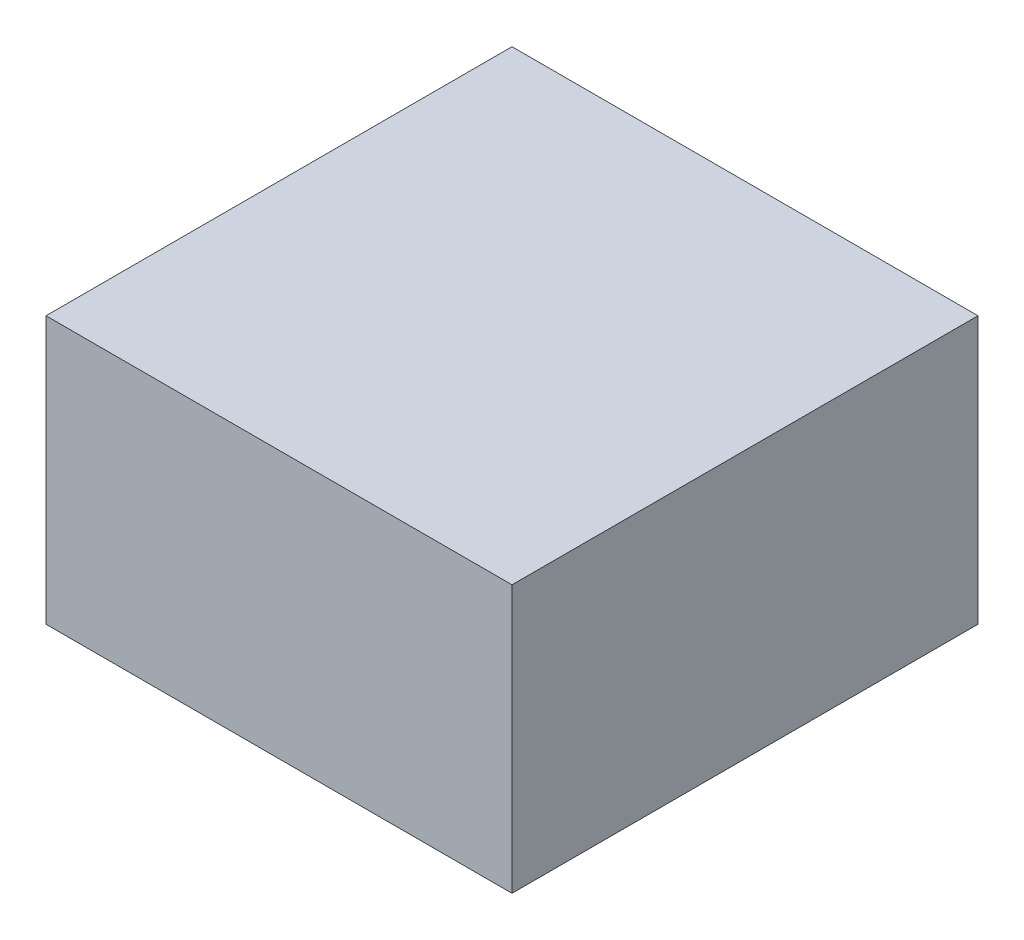
ISO-10303-21;
HEADER;
FILE_DESCRIPTION(('STEP AP214'),'2;1');
FILE_NAME('part.step','',(''),(''),'','','');
FILE_SCHEMA(('AUTOMOTIVE_DESIGN { 1 0 10303 214 1 1 1 1 }'));
ENDSEC;
DATA;
#1=APPLICATION_CONTEXT('core data for automotive mechanical design processes');
#2=APPLICATION_PROTOCOL_DEFINITION('international standard','automotive_design',2000,#1);
#3=PRODUCT_CONTEXT('',#1,'mechanical');
#4=PRODUCT('Part','Part','',(#3));
#5=PRODUCT_RELATED_PRODUCT_CATEGORY('part','',(#4));
#6=PRODUCT_DEFINITION_FORMATION('','',#4);
#7=PRODUCT_DEFINITION_CONTEXT('part definition',#1,'design');
#8=PRODUCT_DEFINITION('design','',#6,#7);
#9=PRODUCT_DEFINITION_SHAPE('','',#8);
#10=(LENGTH_UNIT() NAMED_UNIT(*) SI_UNIT(.MILLI.,.METRE.));
#11=(NAMED_UNIT(*) PLANE_ANGLE_UNIT() SI_UNIT($,.RADIAN.));
#12=(NAMED_UNIT(*) SI_UNIT($,.STERADIAN.) SOLID_ANGLE_UNIT());
#13=UNCERTAINTY_MEASURE_WITH_UNIT(LENGTH_MEASURE(1.E-05),#10,'distance_accuracy_value','');
#14=(GEOMETRIC_REPRESENTATION_CONTEXT(3) GLOBAL_UNCERTAINTY_ASSIGNED_CONTEXT((#13)) GLOBAL_UNIT_ASSIGNED_CONTEXT((#10,
#11,#12)) REPRESENTATION_CONTEXT('',''));
#15=CARTESIAN_POINT('',(0.,0.,0.));
#16=DIRECTION('',(0.,0.,1.));
#17=DIRECTION('',(1.,0.,0.));
#18=AXIS2_PLACEMENT_3D('',#15,#16,#17);
#19=CARTESIAN_POINT('',(0.,0.,150.));
#20=DIRECTION('',(1.,0.,0.));
#21=DIRECTION('',(0.,0.,-1.));
#22=AXIS2_PLACEMENT_3D('',#19,#20,#21);
#23=PLANE('',#22);
#24=DIRECTION('',(0.,-1.,0.));
#25=VECTOR('',#24,1.);
#26=CARTESIAN_POINT('',(0.,0.,0.));
#27=LINE('',#26,#25);
#28=CARTESIAN_POINT('',(0.,86.,0.));
#29=VERTEX_POINT('',#28);
#30=CARTESIAN_POINT('',(0.,0.,0.));
#31=VERTEX_POINT('',#30);
#32=EDGE_CURVE('E98',#29,#31,#27,.T.);
#33=ORIENTED_EDGE('',*,*,#32,.T.);
#34=DIRECTION('',(0.,0.,-1.));
#35=VECTOR('',#34,1.);
#36=CARTESIAN_POINT('',(0.,0.,150.));
#37=LINE('',#36,#35);
#38=CARTESIAN_POINT('',(0.,0.,150.));
#39=VERTEX_POINT('',#38);
#40=EDGE_CURVE('E11',#39,#31,#37,.T.);
#41=ORIENTED_EDGE('',*,*,#40,.F.);
#42=DIRECTION('',(0.,-1.,0.));
#43=VECTOR('',#42,1.);
#44=CARTESIAN_POINT('',(0.,0.,150.));
#45=LINE('',#44,#43);
#46=CARTESIAN_POINT('',(0.,86.,150.));
#47=VERTEX_POINT('',#46);
#48=EDGE_CURVE('E86',#47,#39,#45,.T.);
#49=ORIENTED_EDGE('',*,*,#48,.F.);
#50=DIRECTION('',(0.,0.,-1.));
#51=VECTOR('',#50,1.);
#52=CARTESIAN_POINT('',(0.,86.,150.));
#53=LINE('',#52,#51);
#54=EDGE_CURVE('E94',#47,#29,#53,.T.);
#55=ORIENTED_EDGE('',*,*,#54,.T.);
#56=EDGE_LOOP('',(#33,#41,#49,#55));
#57=FACE_BOUND('',#56,.T.);
#58=ADVANCED_FACE('F35',(#57),#23,.F.);
#59=CARTESIAN_POINT('',(0.,0.,150.));
#60=DIRECTION('',(0.,1.,0.));
#61=DIRECTION('',(0.,0.,1.));
#62=AXIS2_PLACEMENT_3D('',#59,#60,#61);
#63=PLANE('',#62);
#64=DIRECTION('',(1.,0.,0.));
#65=VECTOR('',#64,1.);
#66=CARTESIAN_POINT('',(0.,0.,0.));
#67=LINE('',#66,#65);
#68=CARTESIAN_POINT('',(150.,0.,0.));
#69=VERTEX_POINT('',#68);
#70=EDGE_CURVE('E90',#31,#69,#67,.T.);
#71=ORIENTED_EDGE('',*,*,#70,.T.);
#72=DIRECTION('',(0.,0.,-1.));
#73=VECTOR('',#72,1.);
#74=CARTESIAN_POINT('',(150.,0.,150.));
#75=LINE('',#74,#73);
#76=CARTESIAN_POINT('',(150.,0.,150.));
#77=VERTEX_POINT('',#76);
#78=EDGE_CURVE('E43',#77,#69,#75,.T.);
#79=ORIENTED_EDGE('',*,*,#78,.F.);
#80=DIRECTION('',(1.,0.,0.));
#81=VECTOR('',#80,1.);
#82=CARTESIAN_POINT('',(0.,0.,150.));
#83=LINE('',#82,#81);
#84=EDGE_CURVE('E81',#39,#77,#83,.T.);
#85=ORIENTED_EDGE('',*,*,#84,.F.);
#86=ORIENTED_EDGE('',*,*,#40,.T.);
#87=EDGE_LOOP('',(#71,#79,#85,#86));
#88=FACE_BOUND('',#87,.T.);
#89=ADVANCED_FACE('F89',(#88),#63,.F.);
#90=CARTESIAN_POINT('',(150.,0.,150.));
#91=DIRECTION('',(-1.,0.,0.));
#92=DIRECTION('',(0.,0.,1.));
#93=AXIS2_PLACEMENT_3D('',#90,#91,#92);
#94=PLANE('',#93);
#95=DIRECTION('',(0.,1.,0.));
#96=VECTOR('',#95,1.);
#97=CARTESIAN_POINT('',(150.,0.,0.));
#98=LINE('',#97,#96);
#99=CARTESIAN_POINT('',(150.,86.,0.));
#100=VERTEX_POINT('',#99);
#101=EDGE_CURVE('E68',#69,#100,#98,.T.);
#102=ORIENTED_EDGE('',*,*,#101,.T.);
#103=DIRECTION('',(0.,0.,-1.));
#104=VECTOR('',#103,1.);
#105=CARTESIAN_POINT('',(150.,86.,150.));
#106=LINE('',#105,#104);
#107=CARTESIAN_POINT('',(150.,86.,150.));
#108=VERTEX_POINT('',#107);
#109=EDGE_CURVE('E91',#108,#100,#106,.T.);
#110=ORIENTED_EDGE('',*,*,#109,.F.);
#111=DIRECTION('',(0.,1.,0.));
#112=VECTOR('',#111,1.);
#113=CARTESIAN_POINT('',(150.,0.,150.));
#114=LINE('',#113,#112);
#115=EDGE_CURVE('E84',#77,#108,#114,.T.);
#116=ORIENTED_EDGE('',*,*,#115,.F.);
#117=ORIENTED_EDGE('',*,*,#78,.T.);
#118=EDGE_LOOP('',(#102,#110,#116,#117));
#119=FACE_BOUND('',#118,.T.);
#120=ADVANCED_FACE('F92',(#119),#94,.F.);
#121=CARTESIAN_POINT('',(0.,86.,150.));
#122=DIRECTION('',(0.,-1.,0.));
#123=DIRECTION('',(0.,0.,-1.));
#124=AXIS2_PLACEMENT_3D('',#121,#122,#123);
#125=PLANE('',#124);
#126=DIRECTION('',(-1.,0.,0.));
#127=VECTOR('',#126,1.);
#128=CARTESIAN_POINT('',(0.,86.,0.));
#129=LINE('',#128,#127);
#130=EDGE_CURVE('E74',#100,#29,#129,.T.);
#131=ORIENTED_EDGE('',*,*,#130,.T.);
#132=ORIENTED_EDGE('',*,*,#54,.F.);
#133=DIRECTION('',(-1.,0.,0.));
#134=VECTOR('',#133,1.);
#135=CARTESIAN_POINT('',(0.,86.,150.));
#136=LINE('',#135,#134);
#137=EDGE_CURVE('E51',#108,#47,#136,.T.);
#138=ORIENTED_EDGE('',*,*,#137,.F.);
#139=ORIENTED_EDGE('',*,*,#109,.T.);
#140=EDGE_LOOP('',(#131,#132,#138,#139));
#141=FACE_BOUND('',#140,.T.);
#142=ADVANCED_FACE('F105',(#141),#125,.F.);
#143=CARTESIAN_POINT('',(0.,0.,150.));
#144=DIRECTION('',(0.,0.,-1.));
#145=DIRECTION('',(-1.,0.,0.));
#146=AXIS2_PLACEMENT_3D('',#143,#144,#145);
#147=PLANE('',#146);
#148=ORIENTED_EDGE('',*,*,#48,.T.);
#149=ORIENTED_EDGE('',*,*,#84,.T.);
#150=ORIENTED_EDGE('',*,*,#115,.T.);
#151=ORIENTED_EDGE('',*,*,#137,.T.);
#152=EDGE_LOOP('',(#148,#149,#150,#151));
#153=FACE_BOUND('',#152,.T.);
#154=ADVANCED_FACE('F82',(#153),#147,.F.);
#155=CARTESIAN_POINT('',(0.,0.,0.));
#156=DIRECTION('',(0.,0.,-1.));
#157=DIRECTION('',(-1.,0.,0.));
#158=AXIS2_PLACEMENT_3D('',#155,#156,#157);
#159=PLANE('',#158);
#160=ORIENTED_EDGE('',*,*,#32,.F.);
#161=ORIENTED_EDGE('',*,*,#130,.F.);
#162=ORIENTED_EDGE('',*,*,#101,.F.);
#163=ORIENTED_EDGE('',*,*,#70,.F.);
#164=EDGE_LOOP('',(#160,#161,#162,#163));
#165=FACE_BOUND('',#164,.T.);
#166=ADVANCED_FACE('F108',(#165),#159,.T.);
#167=CLOSED_SHELL('',(#58,#89,#120,#142,#154,#166));
#168=MANIFOLD_SOLID_BREP('B2',#167);
#169=ADVANCED_BREP_SHAPE_REPRESENTATION('',(#18,#168),#14);
#170=SHAPE_DEFINITION_REPRESENTATION(#9,#169);
ENDSEC;
END-ISO-10303-21;
